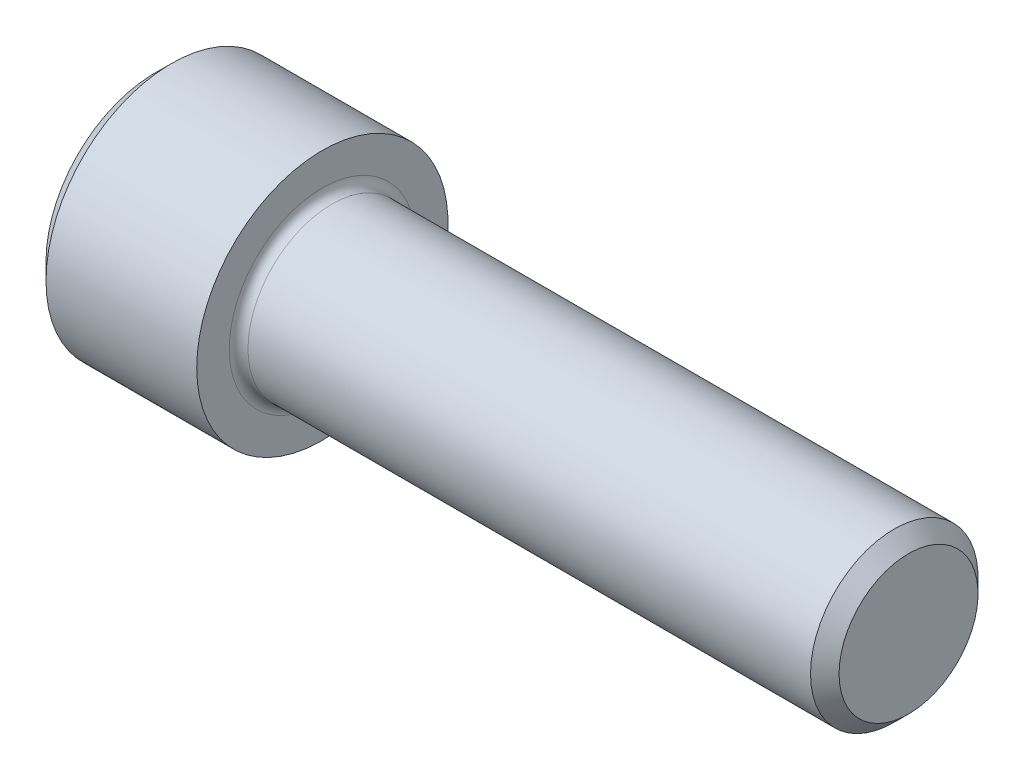
ISO-10303-21;
HEADER;
FILE_DESCRIPTION(('STEP AP214'),'2;1');
FILE_NAME('part.step','',(''),(''),'','','');
FILE_SCHEMA(('AUTOMOTIVE_DESIGN { 1 0 10303 214 1 1 1 1 }'));
ENDSEC;
DATA;
#1=APPLICATION_CONTEXT('core data for automotive mechanical design processes');
#2=APPLICATION_PROTOCOL_DEFINITION('international standard','automotive_design',2000,#1);
#3=PRODUCT_CONTEXT('',#1,'mechanical');
#4=PRODUCT('Part','Part','',(#3));
#5=PRODUCT_RELATED_PRODUCT_CATEGORY('part','',(#4));
#6=PRODUCT_DEFINITION_FORMATION('','',#4);
#7=PRODUCT_DEFINITION_CONTEXT('part definition',#1,'design');
#8=PRODUCT_DEFINITION('design','',#6,#7);
#9=PRODUCT_DEFINITION_SHAPE('','',#8);
#10=(LENGTH_UNIT() NAMED_UNIT(*) SI_UNIT(.MILLI.,.METRE.));
#11=(NAMED_UNIT(*) PLANE_ANGLE_UNIT() SI_UNIT($,.RADIAN.));
#12=(NAMED_UNIT(*) SI_UNIT($,.STERADIAN.) SOLID_ANGLE_UNIT());
#13=UNCERTAINTY_MEASURE_WITH_UNIT(LENGTH_MEASURE(1.E-05),#10,'distance_accuracy_value','');
#14=(GEOMETRIC_REPRESENTATION_CONTEXT(3) GLOBAL_UNCERTAINTY_ASSIGNED_CONTEXT((#13)) GLOBAL_UNIT_ASSIGNED_CONTEXT((#10,
#11,#12)) REPRESENTATION_CONTEXT('',''));
#15=CARTESIAN_POINT('',(0.,0.,0.));
#16=DIRECTION('',(0.,0.,1.));
#17=DIRECTION('',(1.,0.,0.));
#18=AXIS2_PLACEMENT_3D('',#15,#16,#17);
#19=CARTESIAN_POINT('',(0.,0.,0.));
#20=DIRECTION('',(-1.,0.,0.));
#21=DIRECTION('',(0.,0.,1.));
#22=AXIS2_PLACEMENT_3D('',#19,#20,#21);
#23=PLANE('',#22);
#24=DIRECTION('',(0.,-0.499999999999999,0.866025403784439));
#25=VECTOR('',#24,1.);
#26=CARTESIAN_POINT('',(0.,2.7496306570156,0.));
#27=LINE('',#26,#25);
#28=CARTESIAN_POINT('',(0.,2.7496306570156,0.));
#29=VERTEX_POINT('',#28);
#30=CARTESIAN_POINT('',(0.,1.3748153285078,2.38125));
#31=VERTEX_POINT('',#30);
#32=EDGE_CURVE('E373',#29,#31,#27,.T.);
#33=ORIENTED_EDGE('',*,*,#32,.T.);
#34=DIRECTION('',(0.,1.,0.));
#35=VECTOR('',#34,1.);
#36=CARTESIAN_POINT('',(0.,-1.37481532850779,2.38125));
#37=LINE('',#36,#35);
#38=CARTESIAN_POINT('',(0.,-1.37481532850779,2.38125));
#39=VERTEX_POINT('',#38);
#40=EDGE_CURVE('E129',#39,#31,#37,.T.);
#41=ORIENTED_EDGE('',*,*,#40,.F.);
#42=DIRECTION('',(0.,-0.500000000000001,-0.866025403784438));
#43=VECTOR('',#42,1.);
#44=CARTESIAN_POINT('',(0.,-1.37481532850779,2.38125));
#45=LINE('',#44,#43);
#46=CARTESIAN_POINT('',(0.,-2.74963065701559,0.));
#47=VERTEX_POINT('',#46);
#48=EDGE_CURVE('E376',#39,#47,#45,.T.);
#49=ORIENTED_EDGE('',*,*,#48,.T.);
#50=DIRECTION('',(0.,0.499999999999999,-0.866025403784439));
#51=VECTOR('',#50,1.);
#52=CARTESIAN_POINT('',(0.,-2.74963065701559,0.));
#53=LINE('',#52,#51);
#54=CARTESIAN_POINT('',(0.,-1.3748153285078,-2.38125));
#55=VERTEX_POINT('',#54);
#56=EDGE_CURVE('E379',#47,#55,#53,.T.);
#57=ORIENTED_EDGE('',*,*,#56,.T.);
#58=DIRECTION('',(0.,-1.,0.));
#59=VECTOR('',#58,1.);
#60=CARTESIAN_POINT('',(0.,1.3748153285078,-2.38125));
#61=LINE('',#60,#59);
#62=CARTESIAN_POINT('',(0.,1.3748153285078,-2.38125));
#63=VERTEX_POINT('',#62);
#64=EDGE_CURVE('E382',#63,#55,#61,.T.);
#65=ORIENTED_EDGE('',*,*,#64,.F.);
#66=DIRECTION('',(0.,-0.500000000000001,-0.866025403784438));
#67=VECTOR('',#66,1.);
#68=CARTESIAN_POINT('',(0.,2.7496306570156,0.));
#69=LINE('',#68,#67);
#70=EDGE_CURVE('E124',#29,#63,#69,.T.);
#71=ORIENTED_EDGE('',*,*,#70,.F.);
#72=EDGE_LOOP('',(#33,#41,#49,#57,#65,#71));
#73=FACE_BOUND('',#72,.T.);
#74=CARTESIAN_POINT('',(0.,0.,0.));
#75=DIRECTION('',(-1.,0.,0.));
#76=DIRECTION('',(0.,0.,1.));
#77=AXIS2_PLACEMENT_3D('',#74,#75,#76);
#78=CIRCLE('',#77,4.1275);
#79=CARTESIAN_POINT('',(0.,0.,4.1275));
#80=VERTEX_POINT('',#79);
#81=EDGE_CURVE('E140',#80,#80,#78,.T.);
#82=ORIENTED_EDGE('',*,*,#81,.T.);
#83=EDGE_LOOP('',(#82));
#84=FACE_BOUND('',#83,.T.);
#85=ADVANCED_FACE('F33',(#73,#84),#23,.T.);
#86=CARTESIAN_POINT('',(28.575,2.63398,0.));
#87=DIRECTION('',(1.,0.,0.));
#88=DIRECTION('',(0.,0.,-1.));
#89=AXIS2_PLACEMENT_3D('',#86,#87,#88);
#90=PLANE('',#89);
#91=CARTESIAN_POINT('',(28.575,0.,0.));
#92=DIRECTION('',(-1.,0.,0.));
#93=DIRECTION('',(0.,0.,1.));
#94=AXIS2_PLACEMENT_3D('',#91,#92,#93);
#95=CIRCLE('',#94,2.63398);
#96=CARTESIAN_POINT('',(28.575,0.,2.63398));
#97=VERTEX_POINT('',#96);
#98=EDGE_CURVE('E153',#97,#97,#95,.T.);
#99=ORIENTED_EDGE('',*,*,#98,.F.);
#100=EDGE_LOOP('',(#99));
#101=FACE_BOUND('',#100,.T.);
#102=ADVANCED_FACE('F174',(#101),#90,.T.);
#103=CARTESIAN_POINT('',(28.575,0.,0.));
#104=DIRECTION('',(-1.,0.,0.));
#105=DIRECTION('',(0.,0.,1.));
#106=AXIS2_PLACEMENT_3D('',#103,#104,#105);
#107=CONICAL_SURFACE('',#106,2.63398,0.78539816339506);
#108=CARTESIAN_POINT('',(28.0339799999987,0.,0.));
#109=DIRECTION('',(-1.,0.,0.));
#110=DIRECTION('',(0.,0.,1.));
#111=AXIS2_PLACEMENT_3D('',#108,#109,#110);
#112=CIRCLE('',#111,3.1749999999987);
#113=CARTESIAN_POINT('',(28.0339799999987,0.,3.1749999999987));
#114=VERTEX_POINT('',#113);
#115=EDGE_CURVE('E150',#114,#114,#112,.T.);
#116=ORIENTED_EDGE('',*,*,#115,.F.);
#117=EDGE_LOOP('',(#116));
#118=FACE_BOUND('',#117,.T.);
#119=ORIENTED_EDGE('',*,*,#98,.T.);
#120=EDGE_LOOP('',(#119));
#121=FACE_BOUND('',#120,.T.);
#122=ADVANCED_FACE('F180',(#118,#121),#107,.T.);
#123=CARTESIAN_POINT('',(-31.75,0.,0.));
#124=DIRECTION('',(-1.,0.,0.));
#125=DIRECTION('',(0.,0.,1.));
#126=AXIS2_PLACEMENT_3D('',#123,#124,#125);
#127=CYLINDRICAL_SURFACE('',#126,3.17499999999935);
#128=CARTESIAN_POINT('',(6.7056,0.,0.));
#129=DIRECTION('',(1.,0.,0.));
#130=DIRECTION('',(0.,0.,-1.));
#131=AXIS2_PLACEMENT_3D('',#128,#129,#130);
#132=CIRCLE('',#131,3.17499999999935);
#133=CARTESIAN_POINT('',(6.7056,0.,-3.17499999999935));
#134=VERTEX_POINT('',#133);
#135=EDGE_CURVE('E11',#134,#134,#132,.T.);
#136=ORIENTED_EDGE('',*,*,#135,.T.);
#137=EDGE_LOOP('',(#136));
#138=FACE_BOUND('',#137,.T.);
#139=ORIENTED_EDGE('',*,*,#115,.T.);
#140=EDGE_LOOP('',(#139));
#141=FACE_BOUND('',#140,.T.);
#142=ADVANCED_FACE('F191',(#138,#141),#127,.T.);
#143=CARTESIAN_POINT('',(6.35,4.7625,0.));
#144=DIRECTION('',(1.,0.,0.));
#145=DIRECTION('',(0.,0.,-1.));
#146=AXIS2_PLACEMENT_3D('',#143,#144,#145);
#147=PLANE('',#146);
#148=CARTESIAN_POINT('',(6.35,0.,0.));
#149=DIRECTION('',(1.,0.,0.));
#150=DIRECTION('',(0.,0.,-1.));
#151=AXIS2_PLACEMENT_3D('',#148,#149,#150);
#152=CIRCLE('',#151,3.53059999999935);
#153=CARTESIAN_POINT('',(6.35,0.,-3.53059999999935));
#154=VERTEX_POINT('',#153);
#155=EDGE_CURVE('E41',#154,#154,#152,.F.);
#156=ORIENTED_EDGE('',*,*,#155,.T.);
#157=EDGE_LOOP('',(#156));
#158=FACE_BOUND('',#157,.T.);
#159=CARTESIAN_POINT('',(6.35,0.,0.));
#160=DIRECTION('',(-1.,0.,0.));
#161=DIRECTION('',(0.,0.,1.));
#162=AXIS2_PLACEMENT_3D('',#159,#160,#161);
#163=CIRCLE('',#162,4.7625);
#164=CARTESIAN_POINT('',(6.35,0.,4.7625));
#165=VERTEX_POINT('',#164);
#166=EDGE_CURVE('E147',#165,#165,#163,.T.);
#167=ORIENTED_EDGE('',*,*,#166,.F.);
#168=EDGE_LOOP('',(#167));
#169=FACE_BOUND('',#168,.T.);
#170=ADVANCED_FACE('F158',(#158,#169),#147,.T.);
#171=CARTESIAN_POINT('',(-31.75,0.,0.));
#172=DIRECTION('',(-1.,0.,0.));
#173=DIRECTION('',(0.,0.,1.));
#174=AXIS2_PLACEMENT_3D('',#171,#172,#173);
#175=CYLINDRICAL_SURFACE('',#174,4.7625);
#176=ORIENTED_EDGE('',*,*,#166,.T.);
#177=EDGE_LOOP('',(#176));
#178=FACE_BOUND('',#177,.T.);
#179=CARTESIAN_POINT('',(0.634999999999997,0.,0.));
#180=DIRECTION('',(-1.,0.,0.));
#181=DIRECTION('',(0.,0.,1.));
#182=AXIS2_PLACEMENT_3D('',#179,#180,#181);
#183=CIRCLE('',#182,4.7625);
#184=CARTESIAN_POINT('',(0.634999999999997,0.,4.7625));
#185=VERTEX_POINT('',#184);
#186=EDGE_CURVE('E144',#185,#185,#183,.T.);
#187=ORIENTED_EDGE('',*,*,#186,.F.);
#188=EDGE_LOOP('',(#187));
#189=FACE_BOUND('',#188,.T.);
#190=ADVANCED_FACE('F169',(#178,#189),#175,.T.);
#191=CARTESIAN_POINT('',(0.,0.,0.));
#192=DIRECTION('',(1.,0.,0.));
#193=DIRECTION('',(0.,0.,-1.));
#194=AXIS2_PLACEMENT_3D('',#191,#192,#193);
#195=CONICAL_SURFACE('',#194,4.1275,0.785398163397449);
#196=ORIENTED_EDGE('',*,*,#186,.T.);
#197=EDGE_LOOP('',(#196));
#198=FACE_BOUND('',#197,.T.);
#199=ORIENTED_EDGE('',*,*,#81,.F.);
#200=EDGE_LOOP('',(#199));
#201=FACE_BOUND('',#200,.T.);
#202=ADVANCED_FACE('F162',(#198,#201),#195,.T.);
#203=CARTESIAN_POINT('',(6.7056,0.,0.));
#204=DIRECTION('',(1.,0.,0.));
#205=DIRECTION('',(0.,0.,-1.));
#206=AXIS2_PLACEMENT_3D('',#203,#204,#205);
#207=TOROIDAL_SURFACE('',#206,3.53059999999935,0.3556);
#208=ORIENTED_EDGE('',*,*,#135,.F.);
#209=EDGE_LOOP('',(#208));
#210=FACE_BOUND('',#209,.T.);
#211=ORIENTED_EDGE('',*,*,#155,.F.);
#212=EDGE_LOOP('',(#211));
#213=FACE_BOUND('',#212,.T.);
#214=ADVANCED_FACE('F35',(#210,#213),#207,.F.);
#215=CARTESIAN_POINT('',(3.048,2.7496306570156,0.));
#216=DIRECTION('',(0.,-0.866025403784439,-0.499999999999999));
#217=DIRECTION('',(0.,0.499999999999999,-0.866025403784439));
#218=AXIS2_PLACEMENT_3D('',#215,#216,#217);
#219=PLANE('',#218);
#220=ORIENTED_EDGE('',*,*,#32,.F.);
#221=DIRECTION('',(-1.,0.,0.));
#222=VECTOR('',#221,1.);
#223=CARTESIAN_POINT('',(3.048,2.7496306570156,0.));
#224=LINE('',#223,#222);
#225=CARTESIAN_POINT('',(3.048,2.7496306570156,0.));
#226=VERTEX_POINT('',#225);
#227=EDGE_CURVE('E363',#226,#29,#224,.T.);
#228=ORIENTED_EDGE('',*,*,#227,.F.);
#229=DIRECTION('',(0.,-0.499999999999999,0.866025403784439));
#230=VECTOR('',#229,1.);
#231=CARTESIAN_POINT('',(3.048,2.7496306570156,0.));
#232=LINE('',#231,#230);
#233=CARTESIAN_POINT('',(3.048,2.0622229927617,1.190625));
#234=VERTEX_POINT('',#233);
#235=EDGE_CURVE('E116',#226,#234,#232,.T.);
#236=ORIENTED_EDGE('',*,*,#235,.T.);
#237=CARTESIAN_POINT('',(3.048,1.3748153285078,2.38125));
#238=VERTEX_POINT('',#237);
#239=EDGE_CURVE('E107',#234,#238,#232,.T.);
#240=ORIENTED_EDGE('',*,*,#239,.T.);
#241=DIRECTION('',(-1.,0.,0.));
#242=VECTOR('',#241,1.);
#243=CARTESIAN_POINT('',(3.048,1.3748153285078,2.38125));
#244=LINE('',#243,#242);
#245=EDGE_CURVE('E121',#238,#31,#244,.T.);
#246=ORIENTED_EDGE('',*,*,#245,.T.);
#247=EDGE_LOOP('',(#220,#228,#236,#240,#246));
#248=FACE_BOUND('',#247,.T.);
#249=ADVANCED_FACE('F120',(#248),#219,.T.);
#250=CARTESIAN_POINT('',(3.048,-1.37481532850779,2.38125));
#251=DIRECTION('',(0.,0.,1.));
#252=DIRECTION('',(0.,-1.,0.));
#253=AXIS2_PLACEMENT_3D('',#250,#251,#252);
#254=PLANE('',#253);
#255=ORIENTED_EDGE('',*,*,#40,.T.);
#256=ORIENTED_EDGE('',*,*,#245,.F.);
#257=DIRECTION('',(0.,1.,0.));
#258=VECTOR('',#257,1.);
#259=CARTESIAN_POINT('',(3.048,-1.37481532850779,2.38125));
#260=LINE('',#259,#258);
#261=CARTESIAN_POINT('',(3.048,0.,2.38125));
#262=VERTEX_POINT('',#261);
#263=EDGE_CURVE('E104',#262,#238,#260,.T.);
#264=ORIENTED_EDGE('',*,*,#263,.F.);
#265=CARTESIAN_POINT('',(3.048,-1.37481532850779,2.38125));
#266=VERTEX_POINT('',#265);
#267=EDGE_CURVE('E115',#266,#262,#260,.T.);
#268=ORIENTED_EDGE('',*,*,#267,.F.);
#269=DIRECTION('',(-1.,0.,0.));
#270=VECTOR('',#269,1.);
#271=CARTESIAN_POINT('',(3.048,-1.37481532850779,2.38125));
#272=LINE('',#271,#270);
#273=EDGE_CURVE('E131',#266,#39,#272,.T.);
#274=ORIENTED_EDGE('',*,*,#273,.T.);
#275=EDGE_LOOP('',(#255,#256,#264,#268,#274));
#276=FACE_BOUND('',#275,.T.);
#277=ADVANCED_FACE('F126',(#276),#254,.F.);
#278=CARTESIAN_POINT('',(3.048,-1.37481532850779,2.38125));
#279=DIRECTION('',(0.,0.866025403784438,-0.500000000000001));
#280=DIRECTION('',(0.,0.500000000000001,0.866025403784438));
#281=AXIS2_PLACEMENT_3D('',#278,#279,#280);
#282=PLANE('',#281);
#283=ORIENTED_EDGE('',*,*,#48,.F.);
#284=ORIENTED_EDGE('',*,*,#273,.F.);
#285=DIRECTION('',(0.,-0.500000000000001,-0.866025403784438));
#286=VECTOR('',#285,1.);
#287=CARTESIAN_POINT('',(3.048,-1.37481532850779,2.38125));
#288=LINE('',#287,#286);
#289=CARTESIAN_POINT('',(3.048,-2.06222299276169,1.190625));
#290=VERTEX_POINT('',#289);
#291=EDGE_CURVE('E402',#266,#290,#288,.T.);
#292=ORIENTED_EDGE('',*,*,#291,.T.);
#293=CARTESIAN_POINT('',(3.048,-2.74963065701559,0.));
#294=VERTEX_POINT('',#293);
#295=EDGE_CURVE('E391',#290,#294,#288,.T.);
#296=ORIENTED_EDGE('',*,*,#295,.T.);
#297=DIRECTION('',(-1.,0.,0.));
#298=VECTOR('',#297,1.);
#299=CARTESIAN_POINT('',(3.048,-2.74963065701559,0.));
#300=LINE('',#299,#298);
#301=EDGE_CURVE('E136',#294,#47,#300,.T.);
#302=ORIENTED_EDGE('',*,*,#301,.T.);
#303=EDGE_LOOP('',(#283,#284,#292,#296,#302));
#304=FACE_BOUND('',#303,.T.);
#305=ADVANCED_FACE('F254',(#304),#282,.T.);
#306=CARTESIAN_POINT('',(3.048,-2.74963065701559,0.));
#307=DIRECTION('',(0.,0.866025403784439,0.499999999999999));
#308=DIRECTION('',(0.,-0.499999999999999,0.866025403784439));
#309=AXIS2_PLACEMENT_3D('',#306,#307,#308);
#310=PLANE('',#309);
#311=ORIENTED_EDGE('',*,*,#56,.F.);
#312=ORIENTED_EDGE('',*,*,#301,.F.);
#313=DIRECTION('',(0.,0.499999999999999,-0.866025403784439));
#314=VECTOR('',#313,1.);
#315=CARTESIAN_POINT('',(3.048,-2.74963065701559,0.));
#316=LINE('',#315,#314);
#317=CARTESIAN_POINT('',(3.048,-2.06222299276169,-1.190625));
#318=VERTEX_POINT('',#317);
#319=EDGE_CURVE('E369',#294,#318,#316,.T.);
#320=ORIENTED_EDGE('',*,*,#319,.T.);
#321=CARTESIAN_POINT('',(3.048,-1.3748153285078,-2.38125));
#322=VERTEX_POINT('',#321);
#323=EDGE_CURVE('E401',#318,#322,#316,.T.);
#324=ORIENTED_EDGE('',*,*,#323,.T.);
#325=DIRECTION('',(-1.,0.,0.));
#326=VECTOR('',#325,1.);
#327=CARTESIAN_POINT('',(3.048,-1.3748153285078,-2.38125));
#328=LINE('',#327,#326);
#329=EDGE_CURVE('E362',#322,#55,#328,.T.);
#330=ORIENTED_EDGE('',*,*,#329,.T.);
#331=EDGE_LOOP('',(#311,#312,#320,#324,#330));
#332=FACE_BOUND('',#331,.T.);
#333=ADVANCED_FACE('F262',(#332),#310,.T.);
#334=CARTESIAN_POINT('',(3.048,1.3748153285078,-2.38125));
#335=DIRECTION('',(0.,0.,-1.));
#336=DIRECTION('',(0.,1.,0.));
#337=AXIS2_PLACEMENT_3D('',#334,#335,#336);
#338=PLANE('',#337);
#339=ORIENTED_EDGE('',*,*,#64,.T.);
#340=ORIENTED_EDGE('',*,*,#329,.F.);
#341=DIRECTION('',(0.,-1.,0.));
#342=VECTOR('',#341,1.);
#343=CARTESIAN_POINT('',(3.048,1.3748153285078,-2.38125));
#344=LINE('',#343,#342);
#345=CARTESIAN_POINT('',(3.048,0.,-2.38125));
#346=VERTEX_POINT('',#345);
#347=EDGE_CURVE('E366',#346,#322,#344,.T.);
#348=ORIENTED_EDGE('',*,*,#347,.F.);
#349=CARTESIAN_POINT('',(3.048,1.3748153285078,-2.38125));
#350=VERTEX_POINT('',#349);
#351=EDGE_CURVE('E48',#350,#346,#344,.T.);
#352=ORIENTED_EDGE('',*,*,#351,.F.);
#353=DIRECTION('',(-1.,0.,0.));
#354=VECTOR('',#353,1.);
#355=CARTESIAN_POINT('',(3.048,1.3748153285078,-2.38125));
#356=LINE('',#355,#354);
#357=EDGE_CURVE('E359',#350,#63,#356,.T.);
#358=ORIENTED_EDGE('',*,*,#357,.T.);
#359=EDGE_LOOP('',(#339,#340,#348,#352,#358));
#360=FACE_BOUND('',#359,.T.);
#361=ADVANCED_FACE('F271',(#360),#338,.F.);
#362=CARTESIAN_POINT('',(3.048,2.7496306570156,0.));
#363=DIRECTION('',(0.,0.866025403784438,-0.500000000000001));
#364=DIRECTION('',(0.,0.500000000000001,0.866025403784438));
#365=AXIS2_PLACEMENT_3D('',#362,#363,#364);
#366=PLANE('',#365);
#367=ORIENTED_EDGE('',*,*,#70,.T.);
#368=ORIENTED_EDGE('',*,*,#357,.F.);
#369=DIRECTION('',(0.,-0.500000000000001,-0.866025403784438));
#370=VECTOR('',#369,1.);
#371=CARTESIAN_POINT('',(3.048,2.7496306570156,0.));
#372=LINE('',#371,#370);
#373=CARTESIAN_POINT('',(3.048,2.0622229927617,-1.19062500000001));
#374=VERTEX_POINT('',#373);
#375=EDGE_CURVE('E349',#374,#350,#372,.T.);
#376=ORIENTED_EDGE('',*,*,#375,.F.);
#377=EDGE_CURVE('E355',#226,#374,#372,.T.);
#378=ORIENTED_EDGE('',*,*,#377,.F.);
#379=ORIENTED_EDGE('',*,*,#227,.T.);
#380=EDGE_LOOP('',(#367,#368,#376,#378,#379));
#381=FACE_BOUND('',#380,.T.);
#382=ADVANCED_FACE('F280',(#381),#366,.F.);
#383=CARTESIAN_POINT('',(3.048,4.12444598552339,-2.38125000000001));
#384=DIRECTION('',(1.,0.,0.));
#385=DIRECTION('',(0.,0.,-1.));
#386=AXIS2_PLACEMENT_3D('',#383,#384,#385);
#387=PLANE('',#386);
#388=ORIENTED_EDGE('',*,*,#347,.T.);
#389=ORIENTED_EDGE('',*,*,#323,.F.);
#390=CARTESIAN_POINT('',(3.048,0.,0.));
#391=DIRECTION('',(-1.,0.,0.));
#392=DIRECTION('',(0.,0.,1.));
#393=AXIS2_PLACEMENT_3D('',#390,#391,#392);
#394=CIRCLE('',#393,2.38125);
#395=EDGE_CURVE('E397',#346,#318,#394,.T.);
#396=ORIENTED_EDGE('',*,*,#395,.F.);
#397=EDGE_LOOP('',(#388,#389,#396));
#398=FACE_BOUND('',#397,.T.);
#399=ADVANCED_FACE('F289',(#398),#387,.F.);
#400=ORIENTED_EDGE('',*,*,#319,.F.);
#401=ORIENTED_EDGE('',*,*,#295,.F.);
#402=EDGE_CURVE('E134',#318,#290,#394,.T.);
#403=ORIENTED_EDGE('',*,*,#402,.F.);
#404=EDGE_LOOP('',(#400,#401,#403));
#405=FACE_BOUND('',#404,.T.);
#406=ADVANCED_FACE('F298',(#405),#387,.F.);
#407=ORIENTED_EDGE('',*,*,#291,.F.);
#408=ORIENTED_EDGE('',*,*,#267,.T.);
#409=EDGE_CURVE('E130',#290,#262,#394,.T.);
#410=ORIENTED_EDGE('',*,*,#409,.F.);
#411=EDGE_LOOP('',(#407,#408,#410));
#412=FACE_BOUND('',#411,.T.);
#413=ADVANCED_FACE('F307',(#412),#387,.F.);
#414=ORIENTED_EDGE('',*,*,#263,.T.);
#415=ORIENTED_EDGE('',*,*,#239,.F.);
#416=EDGE_CURVE('E110',#262,#234,#394,.T.);
#417=ORIENTED_EDGE('',*,*,#416,.F.);
#418=EDGE_LOOP('',(#414,#415,#417));
#419=FACE_BOUND('',#418,.T.);
#420=ADVANCED_FACE('F106',(#419),#387,.F.);
#421=ORIENTED_EDGE('',*,*,#235,.F.);
#422=ORIENTED_EDGE('',*,*,#377,.T.);
#423=EDGE_CURVE('E141',#234,#374,#394,.T.);
#424=ORIENTED_EDGE('',*,*,#423,.F.);
#425=EDGE_LOOP('',(#421,#422,#424));
#426=FACE_BOUND('',#425,.T.);
#427=ADVANCED_FACE('F322',(#426),#387,.F.);
#428=ORIENTED_EDGE('',*,*,#375,.T.);
#429=ORIENTED_EDGE('',*,*,#351,.T.);
#430=EDGE_CURVE('E352',#374,#346,#394,.T.);
#431=ORIENTED_EDGE('',*,*,#430,.F.);
#432=EDGE_LOOP('',(#428,#429,#431));
#433=FACE_BOUND('',#432,.T.);
#434=ADVANCED_FACE('F237',(#433),#387,.F.);
#435=CARTESIAN_POINT('',(3.048,0.,0.));
#436=DIRECTION('',(-1.,0.,0.));
#437=DIRECTION('',(0.,0.,1.));
#438=AXIS2_PLACEMENT_3D('',#435,#436,#437);
#439=CONICAL_SURFACE('',#438,2.38125,1.04719755119659);
#440=CARTESIAN_POINT('',(4.42281532850781,0.,0.));
#441=VERTEX_POINT('',#440);
#442=VERTEX_LOOP('',#441);
#443=FACE_BOUND('',#442,.T.);
#444=ORIENTED_EDGE('',*,*,#416,.T.);
#445=ORIENTED_EDGE('',*,*,#423,.T.);
#446=ORIENTED_EDGE('',*,*,#430,.T.);
#447=ORIENTED_EDGE('',*,*,#395,.T.);
#448=ORIENTED_EDGE('',*,*,#402,.T.);
#449=ORIENTED_EDGE('',*,*,#409,.T.);
#450=EDGE_LOOP('',(#444,#445,#446,#447,#448,#449));
#451=FACE_BOUND('',#450,.T.);
#452=ADVANCED_FACE('F184',(#443,#451),#439,.F.);
#453=CLOSED_SHELL('',(#85,#102,#122,#142,#170,#190,#202,#214,#249,#277,#305,#333,#361,#382,#399,
#406,#413,#420,#427,#434,#452));
#454=MANIFOLD_SOLID_BREP('B2',#453);
#455=ADVANCED_BREP_SHAPE_REPRESENTATION('',(#18,#454),#14);
#456=SHAPE_DEFINITION_REPRESENTATION(#9,#455);
ENDSEC;
END-ISO-10303-21;
